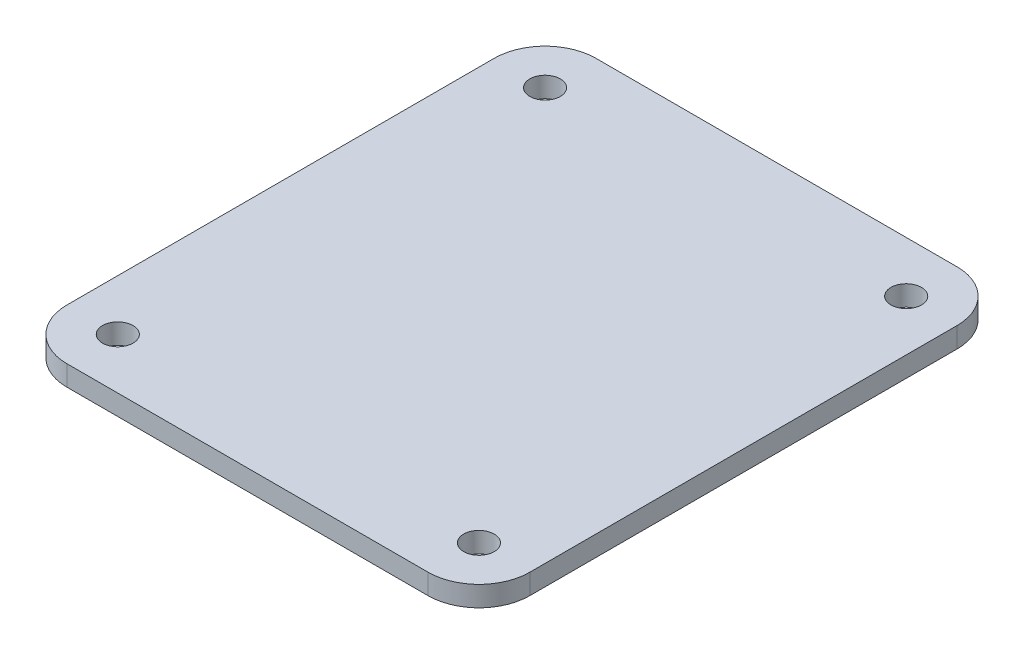
ISO-10303-21;
HEADER;
FILE_DESCRIPTION(('STEP AP214'),'2;1');
FILE_NAME('part.step','',(''),(''),'','','');
FILE_SCHEMA(('AUTOMOTIVE_DESIGN { 1 0 10303 214 1 1 1 1 }'));
ENDSEC;
DATA;
#1=APPLICATION_CONTEXT('core data for automotive mechanical design processes');
#2=APPLICATION_PROTOCOL_DEFINITION('international standard','automotive_design',2000,#1);
#3=PRODUCT_CONTEXT('',#1,'mechanical');
#4=PRODUCT('Part','Part','',(#3));
#5=PRODUCT_RELATED_PRODUCT_CATEGORY('part','',(#4));
#6=PRODUCT_DEFINITION_FORMATION('','',#4);
#7=PRODUCT_DEFINITION_CONTEXT('part definition',#1,'design');
#8=PRODUCT_DEFINITION('design','',#6,#7);
#9=PRODUCT_DEFINITION_SHAPE('','',#8);
#10=(LENGTH_UNIT() NAMED_UNIT(*) SI_UNIT(.MILLI.,.METRE.));
#11=(NAMED_UNIT(*) PLANE_ANGLE_UNIT() SI_UNIT($,.RADIAN.));
#12=(NAMED_UNIT(*) SI_UNIT($,.STERADIAN.) SOLID_ANGLE_UNIT());
#13=UNCERTAINTY_MEASURE_WITH_UNIT(LENGTH_MEASURE(1.E-05),#10,'distance_accuracy_value','');
#14=(GEOMETRIC_REPRESENTATION_CONTEXT(3) GLOBAL_UNCERTAINTY_ASSIGNED_CONTEXT((#13)) GLOBAL_UNIT_ASSIGNED_CONTEXT((#10,
#11,#12)) REPRESENTATION_CONTEXT('',''));
#15=CARTESIAN_POINT('',(0.,0.,0.));
#16=DIRECTION('',(0.,0.,1.));
#17=DIRECTION('',(1.,0.,0.));
#18=AXIS2_PLACEMENT_3D('',#15,#16,#17);
#19=CARTESIAN_POINT('',(-17.75,2.,21.));
#20=DIRECTION('',(0.,-1.,0.));
#21=DIRECTION('',(0.,0.,-1.));
#22=AXIS2_PLACEMENT_3D('',#19,#20,#21);
#23=PLANE('',#22);
#24=CARTESIAN_POINT('',(-17.75,2.,21.));
#25=DIRECTION('',(0.,1.,0.));
#26=DIRECTION('',(0.,0.,1.));
#27=AXIS2_PLACEMENT_3D('',#24,#25,#26);
#28=CIRCLE('',#27,1.5);
#29=CARTESIAN_POINT('',(-17.75,2.,22.5));
#30=VERTEX_POINT('',#29);
#31=EDGE_CURVE('E188',#30,#30,#28,.T.);
#32=ORIENTED_EDGE('',*,*,#31,.F.);
#33=EDGE_LOOP('',(#32));
#34=FACE_BOUND('',#33,.T.);
#35=CARTESIAN_POINT('',(17.75,2.,-21.));
#36=DIRECTION('',(0.,1.,0.));
#37=DIRECTION('',(0.,0.,1.));
#38=AXIS2_PLACEMENT_3D('',#35,#36,#37);
#39=CIRCLE('',#38,1.5);
#40=CARTESIAN_POINT('',(17.75,2.,-19.5));
#41=VERTEX_POINT('',#40);
#42=EDGE_CURVE('E134',#41,#41,#39,.T.);
#43=ORIENTED_EDGE('',*,*,#42,.F.);
#44=EDGE_LOOP('',(#43));
#45=FACE_BOUND('',#44,.T.);
#46=CARTESIAN_POINT('',(-17.75,2.,21.));
#47=DIRECTION('',(0.,1.,0.));
#48=DIRECTION('',(0.,0.,-1.));
#49=AXIS2_PLACEMENT_3D('',#46,#47,#48);
#50=CIRCLE('',#49,5.);
#51=CARTESIAN_POINT('',(-22.75,2.,21.));
#52=VERTEX_POINT('',#51);
#53=CARTESIAN_POINT('',(-17.75,2.,26.));
#54=VERTEX_POINT('',#53);
#55=EDGE_CURVE('E145',#52,#54,#50,.T.);
#56=ORIENTED_EDGE('',*,*,#55,.T.);
#57=DIRECTION('',(1.,0.,0.));
#58=VECTOR('',#57,1.);
#59=CARTESIAN_POINT('',(-17.75,2.,26.));
#60=LINE('',#59,#58);
#61=CARTESIAN_POINT('',(17.75,2.,26.));
#62=VERTEX_POINT('',#61);
#63=EDGE_CURVE('E93',#54,#62,#60,.T.);
#64=ORIENTED_EDGE('',*,*,#63,.T.);
#65=CARTESIAN_POINT('',(17.75,2.,21.));
#66=DIRECTION('',(0.,1.,0.));
#67=DIRECTION('',(0.,0.,-1.));
#68=AXIS2_PLACEMENT_3D('',#65,#66,#67);
#69=CIRCLE('',#68,5.);
#70=CARTESIAN_POINT('',(22.75,2.,21.));
#71=VERTEX_POINT('',#70);
#72=EDGE_CURVE('E160',#62,#71,#69,.T.);
#73=ORIENTED_EDGE('',*,*,#72,.T.);
#74=DIRECTION('',(0.,0.,-1.));
#75=VECTOR('',#74,1.);
#76=CARTESIAN_POINT('',(22.75,2.,-21.));
#77=LINE('',#76,#75);
#78=CARTESIAN_POINT('',(22.75,2.,-21.));
#79=VERTEX_POINT('',#78);
#80=EDGE_CURVE('E173',#71,#79,#77,.T.);
#81=ORIENTED_EDGE('',*,*,#80,.T.);
#82=CARTESIAN_POINT('',(17.75,2.,-21.));
#83=DIRECTION('',(0.,1.,0.));
#84=DIRECTION('',(0.,0.,-1.));
#85=AXIS2_PLACEMENT_3D('',#82,#83,#84);
#86=CIRCLE('',#85,5.);
#87=CARTESIAN_POINT('',(17.75,2.,-26.));
#88=VERTEX_POINT('',#87);
#89=EDGE_CURVE('E112',#79,#88,#86,.T.);
#90=ORIENTED_EDGE('',*,*,#89,.T.);
#91=DIRECTION('',(-1.,0.,0.));
#92=VECTOR('',#91,1.);
#93=CARTESIAN_POINT('',(-17.75,2.,-26.));
#94=LINE('',#93,#92);
#95=CARTESIAN_POINT('',(-17.75,2.,-26.));
#96=VERTEX_POINT('',#95);
#97=EDGE_CURVE('E106',#88,#96,#94,.T.);
#98=ORIENTED_EDGE('',*,*,#97,.T.);
#99=CARTESIAN_POINT('',(-17.75,2.,-21.));
#100=DIRECTION('',(0.,1.,0.));
#101=DIRECTION('',(0.,0.,1.));
#102=AXIS2_PLACEMENT_3D('',#99,#100,#101);
#103=CIRCLE('',#102,5.);
#104=CARTESIAN_POINT('',(-22.75,2.,-21.));
#105=VERTEX_POINT('',#104);
#106=EDGE_CURVE('E110',#96,#105,#103,.T.);
#107=ORIENTED_EDGE('',*,*,#106,.T.);
#108=DIRECTION('',(0.,0.,1.));
#109=VECTOR('',#108,1.);
#110=CARTESIAN_POINT('',(-22.75,2.,-21.));
#111=LINE('',#110,#109);
#112=EDGE_CURVE('E50',#105,#52,#111,.T.);
#113=ORIENTED_EDGE('',*,*,#112,.T.);
#114=EDGE_LOOP('',(#56,#64,#73,#81,#90,#98,#107,#113));
#115=FACE_BOUND('',#114,.T.);
#116=CARTESIAN_POINT('',(-17.75,2.,-21.));
#117=DIRECTION('',(0.,1.,0.));
#118=DIRECTION('',(0.,0.,1.));
#119=AXIS2_PLACEMENT_3D('',#116,#117,#118);
#120=CIRCLE('',#119,1.5);
#121=CARTESIAN_POINT('',(-17.75,2.,-19.5));
#122=VERTEX_POINT('',#121);
#123=EDGE_CURVE('E182',#122,#122,#120,.T.);
#124=ORIENTED_EDGE('',*,*,#123,.F.);
#125=EDGE_LOOP('',(#124));
#126=FACE_BOUND('',#125,.T.);
#127=CARTESIAN_POINT('',(17.75,2.,21.));
#128=DIRECTION('',(0.,1.,0.));
#129=DIRECTION('',(0.,0.,1.));
#130=AXIS2_PLACEMENT_3D('',#127,#128,#129);
#131=CIRCLE('',#130,1.5);
#132=CARTESIAN_POINT('',(17.75,2.,22.5));
#133=VERTEX_POINT('',#132);
#134=EDGE_CURVE('E194',#133,#133,#131,.T.);
#135=ORIENTED_EDGE('',*,*,#134,.F.);
#136=EDGE_LOOP('',(#135));
#137=FACE_BOUND('',#136,.T.);
#138=ADVANCED_FACE('F33',(#34,#45,#115,#126,#137),#23,.F.);
#139=CARTESIAN_POINT('',(-17.75,0.,21.));
#140=DIRECTION('',(0.,-1.,0.));
#141=DIRECTION('',(0.,0.,-1.));
#142=AXIS2_PLACEMENT_3D('',#139,#140,#141);
#143=PLANE('',#142);
#144=CARTESIAN_POINT('',(-17.75,0.,21.));
#145=DIRECTION('',(0.,1.,0.));
#146=DIRECTION('',(0.,0.,1.));
#147=AXIS2_PLACEMENT_3D('',#144,#145,#146);
#148=CIRCLE('',#147,1.5);
#149=CARTESIAN_POINT('',(-17.75,0.,22.5));
#150=VERTEX_POINT('',#149);
#151=EDGE_CURVE('E191',#150,#150,#148,.T.);
#152=ORIENTED_EDGE('',*,*,#151,.T.);
#153=EDGE_LOOP('',(#152));
#154=FACE_BOUND('',#153,.T.);
#155=CARTESIAN_POINT('',(17.75,0.,-21.));
#156=DIRECTION('',(0.,1.,0.));
#157=DIRECTION('',(0.,0.,1.));
#158=AXIS2_PLACEMENT_3D('',#155,#156,#157);
#159=CIRCLE('',#158,1.5);
#160=CARTESIAN_POINT('',(17.75,0.,-19.5));
#161=VERTEX_POINT('',#160);
#162=EDGE_CURVE('E179',#161,#161,#159,.T.);
#163=ORIENTED_EDGE('',*,*,#162,.T.);
#164=EDGE_LOOP('',(#163));
#165=FACE_BOUND('',#164,.T.);
#166=CARTESIAN_POINT('',(-17.75,0.,21.));
#167=DIRECTION('',(0.,1.,0.));
#168=DIRECTION('',(0.,0.,-1.));
#169=AXIS2_PLACEMENT_3D('',#166,#167,#168);
#170=CIRCLE('',#169,5.);
#171=CARTESIAN_POINT('',(-22.75,0.,21.));
#172=VERTEX_POINT('',#171);
#173=CARTESIAN_POINT('',(-17.75,0.,26.));
#174=VERTEX_POINT('',#173);
#175=EDGE_CURVE('E130',#172,#174,#170,.T.);
#176=ORIENTED_EDGE('',*,*,#175,.F.);
#177=DIRECTION('',(0.,0.,1.));
#178=VECTOR('',#177,1.);
#179=CARTESIAN_POINT('',(-22.75,0.,-21.));
#180=LINE('',#179,#178);
#181=CARTESIAN_POINT('',(-22.75,0.,-21.));
#182=VERTEX_POINT('',#181);
#183=EDGE_CURVE('E85',#182,#172,#180,.T.);
#184=ORIENTED_EDGE('',*,*,#183,.F.);
#185=CARTESIAN_POINT('',(-17.75,0.,-21.));
#186=DIRECTION('',(0.,1.,0.));
#187=DIRECTION('',(0.,0.,1.));
#188=AXIS2_PLACEMENT_3D('',#185,#186,#187);
#189=CIRCLE('',#188,5.);
#190=CARTESIAN_POINT('',(-17.75,0.,-26.));
#191=VERTEX_POINT('',#190);
#192=EDGE_CURVE('E79',#191,#182,#189,.T.);
#193=ORIENTED_EDGE('',*,*,#192,.F.);
#194=DIRECTION('',(-1.,0.,0.));
#195=VECTOR('',#194,1.);
#196=CARTESIAN_POINT('',(-17.75,0.,-26.));
#197=LINE('',#196,#195);
#198=CARTESIAN_POINT('',(17.75,0.,-26.));
#199=VERTEX_POINT('',#198);
#200=EDGE_CURVE('E120',#199,#191,#197,.T.);
#201=ORIENTED_EDGE('',*,*,#200,.F.);
#202=CARTESIAN_POINT('',(17.75,0.,-21.));
#203=DIRECTION('',(0.,1.,0.));
#204=DIRECTION('',(0.,0.,-1.));
#205=AXIS2_PLACEMENT_3D('',#202,#203,#204);
#206=CIRCLE('',#205,5.);
#207=CARTESIAN_POINT('',(22.75,0.,-21.));
#208=VERTEX_POINT('',#207);
#209=EDGE_CURVE('E140',#208,#199,#206,.T.);
#210=ORIENTED_EDGE('',*,*,#209,.F.);
#211=DIRECTION('',(0.,0.,-1.));
#212=VECTOR('',#211,1.);
#213=CARTESIAN_POINT('',(22.75,0.,-21.));
#214=LINE('',#213,#212);
#215=CARTESIAN_POINT('',(22.75,0.,21.));
#216=VERTEX_POINT('',#215);
#217=EDGE_CURVE('E138',#216,#208,#214,.T.);
#218=ORIENTED_EDGE('',*,*,#217,.F.);
#219=CARTESIAN_POINT('',(17.75,0.,21.));
#220=DIRECTION('',(0.,1.,0.));
#221=DIRECTION('',(0.,0.,-1.));
#222=AXIS2_PLACEMENT_3D('',#219,#220,#221);
#223=CIRCLE('',#222,5.);
#224=CARTESIAN_POINT('',(17.75,0.,26.));
#225=VERTEX_POINT('',#224);
#226=EDGE_CURVE('E136',#225,#216,#223,.T.);
#227=ORIENTED_EDGE('',*,*,#226,.F.);
#228=DIRECTION('',(1.,0.,0.));
#229=VECTOR('',#228,1.);
#230=CARTESIAN_POINT('',(-17.75,0.,26.));
#231=LINE('',#230,#229);
#232=EDGE_CURVE('E133',#174,#225,#231,.T.);
#233=ORIENTED_EDGE('',*,*,#232,.F.);
#234=EDGE_LOOP('',(#176,#184,#193,#201,#210,#218,#227,#233));
#235=FACE_BOUND('',#234,.T.);
#236=CARTESIAN_POINT('',(-17.75,0.,-21.));
#237=DIRECTION('',(0.,1.,0.));
#238=DIRECTION('',(0.,0.,1.));
#239=AXIS2_PLACEMENT_3D('',#236,#237,#238);
#240=CIRCLE('',#239,1.5);
#241=CARTESIAN_POINT('',(-17.75,0.,-19.5));
#242=VERTEX_POINT('',#241);
#243=EDGE_CURVE('E185',#242,#242,#240,.T.);
#244=ORIENTED_EDGE('',*,*,#243,.T.);
#245=EDGE_LOOP('',(#244));
#246=FACE_BOUND('',#245,.T.);
#247=CARTESIAN_POINT('',(17.75,0.,21.));
#248=DIRECTION('',(0.,1.,0.));
#249=DIRECTION('',(0.,0.,1.));
#250=AXIS2_PLACEMENT_3D('',#247,#248,#249);
#251=CIRCLE('',#250,1.5);
#252=CARTESIAN_POINT('',(17.75,0.,22.5));
#253=VERTEX_POINT('',#252);
#254=EDGE_CURVE('E197',#253,#253,#251,.T.);
#255=ORIENTED_EDGE('',*,*,#254,.T.);
#256=EDGE_LOOP('',(#255));
#257=FACE_BOUND('',#256,.T.);
#258=ADVANCED_FACE('F164',(#154,#165,#235,#246,#257),#143,.T.);
#259=CARTESIAN_POINT('',(-17.75,2.,21.));
#260=DIRECTION('',(0.,-1.,0.));
#261=DIRECTION('',(0.,0.,-1.));
#262=AXIS2_PLACEMENT_3D('',#259,#260,#261);
#263=CYLINDRICAL_SURFACE('',#262,5.);
#264=ORIENTED_EDGE('',*,*,#175,.T.);
#265=DIRECTION('',(0.,-1.,0.));
#266=VECTOR('',#265,1.);
#267=CARTESIAN_POINT('',(-17.75,2.,26.));
#268=LINE('',#267,#266);
#269=EDGE_CURVE('E11',#54,#174,#268,.T.);
#270=ORIENTED_EDGE('',*,*,#269,.F.);
#271=ORIENTED_EDGE('',*,*,#55,.F.);
#272=DIRECTION('',(0.,-1.,0.));
#273=VECTOR('',#272,1.);
#274=CARTESIAN_POINT('',(-22.75,2.,21.));
#275=LINE('',#274,#273);
#276=EDGE_CURVE('E126',#52,#172,#275,.T.);
#277=ORIENTED_EDGE('',*,*,#276,.T.);
#278=EDGE_LOOP('',(#264,#270,#271,#277));
#279=FACE_BOUND('',#278,.T.);
#280=ADVANCED_FACE('F35',(#279),#263,.T.);
#281=CARTESIAN_POINT('',(-17.75,2.,26.));
#282=DIRECTION('',(0.,0.,-1.));
#283=DIRECTION('',(-1.,0.,0.));
#284=AXIS2_PLACEMENT_3D('',#281,#282,#283);
#285=PLANE('',#284);
#286=ORIENTED_EDGE('',*,*,#232,.T.);
#287=DIRECTION('',(0.,-1.,0.));
#288=VECTOR('',#287,1.);
#289=CARTESIAN_POINT('',(17.75,2.,26.));
#290=LINE('',#289,#288);
#291=EDGE_CURVE('E42',#62,#225,#290,.T.);
#292=ORIENTED_EDGE('',*,*,#291,.F.);
#293=ORIENTED_EDGE('',*,*,#63,.F.);
#294=ORIENTED_EDGE('',*,*,#269,.T.);
#295=EDGE_LOOP('',(#286,#292,#293,#294));
#296=FACE_BOUND('',#295,.T.);
#297=ADVANCED_FACE('F232',(#296),#285,.F.);
#298=CARTESIAN_POINT('',(17.75,2.,21.));
#299=DIRECTION('',(0.,-1.,0.));
#300=DIRECTION('',(0.,0.,-1.));
#301=AXIS2_PLACEMENT_3D('',#298,#299,#300);
#302=CYLINDRICAL_SURFACE('',#301,5.);
#303=ORIENTED_EDGE('',*,*,#226,.T.);
#304=DIRECTION('',(0.,-1.,0.));
#305=VECTOR('',#304,1.);
#306=CARTESIAN_POINT('',(22.75,2.,21.));
#307=LINE('',#306,#305);
#308=EDGE_CURVE('E152',#71,#216,#307,.T.);
#309=ORIENTED_EDGE('',*,*,#308,.F.);
#310=ORIENTED_EDGE('',*,*,#72,.F.);
#311=ORIENTED_EDGE('',*,*,#291,.T.);
#312=EDGE_LOOP('',(#303,#309,#310,#311));
#313=FACE_BOUND('',#312,.T.);
#314=ADVANCED_FACE('F158',(#313),#302,.T.);
#315=CARTESIAN_POINT('',(22.75,2.,-21.));
#316=DIRECTION('',(-1.,0.,0.));
#317=DIRECTION('',(0.,0.,1.));
#318=AXIS2_PLACEMENT_3D('',#315,#316,#317);
#319=PLANE('',#318);
#320=ORIENTED_EDGE('',*,*,#217,.T.);
#321=DIRECTION('',(0.,-1.,0.));
#322=VECTOR('',#321,1.);
#323=CARTESIAN_POINT('',(22.75,2.,-21.));
#324=LINE('',#323,#322);
#325=EDGE_CURVE('E149',#79,#208,#324,.T.);
#326=ORIENTED_EDGE('',*,*,#325,.F.);
#327=ORIENTED_EDGE('',*,*,#80,.F.);
#328=ORIENTED_EDGE('',*,*,#308,.T.);
#329=EDGE_LOOP('',(#320,#326,#327,#328));
#330=FACE_BOUND('',#329,.T.);
#331=ADVANCED_FACE('F169',(#330),#319,.F.);
#332=CARTESIAN_POINT('',(17.75,2.,-21.));
#333=DIRECTION('',(0.,-1.,0.));
#334=DIRECTION('',(0.,0.,-1.));
#335=AXIS2_PLACEMENT_3D('',#332,#333,#334);
#336=CYLINDRICAL_SURFACE('',#335,5.);
#337=ORIENTED_EDGE('',*,*,#209,.T.);
#338=DIRECTION('',(0.,-1.,0.));
#339=VECTOR('',#338,1.);
#340=CARTESIAN_POINT('',(17.75,2.,-26.));
#341=LINE('',#340,#339);
#342=EDGE_CURVE('E121',#88,#199,#341,.T.);
#343=ORIENTED_EDGE('',*,*,#342,.F.);
#344=ORIENTED_EDGE('',*,*,#89,.F.);
#345=ORIENTED_EDGE('',*,*,#325,.T.);
#346=EDGE_LOOP('',(#337,#343,#344,#345));
#347=FACE_BOUND('',#346,.T.);
#348=ADVANCED_FACE('F172',(#347),#336,.T.);
#349=CARTESIAN_POINT('',(-17.75,2.,-26.));
#350=DIRECTION('',(0.,0.,1.));
#351=DIRECTION('',(1.,0.,0.));
#352=AXIS2_PLACEMENT_3D('',#349,#350,#351);
#353=PLANE('',#352);
#354=ORIENTED_EDGE('',*,*,#200,.T.);
#355=DIRECTION('',(0.,-1.,0.));
#356=VECTOR('',#355,1.);
#357=CARTESIAN_POINT('',(-17.75,2.,-26.));
#358=LINE('',#357,#356);
#359=EDGE_CURVE('E117',#96,#191,#358,.T.);
#360=ORIENTED_EDGE('',*,*,#359,.F.);
#361=ORIENTED_EDGE('',*,*,#97,.F.);
#362=ORIENTED_EDGE('',*,*,#342,.T.);
#363=EDGE_LOOP('',(#354,#360,#361,#362));
#364=FACE_BOUND('',#363,.T.);
#365=ADVANCED_FACE('F118',(#364),#353,.F.);
#366=CARTESIAN_POINT('',(-17.75,2.,-21.));
#367=DIRECTION('',(0.,-1.,0.));
#368=DIRECTION('',(0.,0.,-1.));
#369=AXIS2_PLACEMENT_3D('',#366,#367,#368);
#370=CYLINDRICAL_SURFACE('',#369,5.);
#371=ORIENTED_EDGE('',*,*,#192,.T.);
#372=DIRECTION('',(0.,-1.,0.));
#373=VECTOR('',#372,1.);
#374=CARTESIAN_POINT('',(-22.75,2.,-21.));
#375=LINE('',#374,#373);
#376=EDGE_CURVE('E122',#105,#182,#375,.T.);
#377=ORIENTED_EDGE('',*,*,#376,.F.);
#378=ORIENTED_EDGE('',*,*,#106,.F.);
#379=ORIENTED_EDGE('',*,*,#359,.T.);
#380=EDGE_LOOP('',(#371,#377,#378,#379));
#381=FACE_BOUND('',#380,.T.);
#382=ADVANCED_FACE('F124',(#381),#370,.T.);
#383=CARTESIAN_POINT('',(-22.75,2.,-21.));
#384=DIRECTION('',(1.,0.,0.));
#385=DIRECTION('',(0.,0.,-1.));
#386=AXIS2_PLACEMENT_3D('',#383,#384,#385);
#387=PLANE('',#386);
#388=ORIENTED_EDGE('',*,*,#183,.T.);
#389=ORIENTED_EDGE('',*,*,#276,.F.);
#390=ORIENTED_EDGE('',*,*,#112,.F.);
#391=ORIENTED_EDGE('',*,*,#376,.T.);
#392=EDGE_LOOP('',(#388,#389,#390,#391));
#393=FACE_BOUND('',#392,.T.);
#394=ADVANCED_FACE('F220',(#393),#387,.F.);
#395=CARTESIAN_POINT('',(17.75,2.,-21.));
#396=DIRECTION('',(0.,-1.,0.));
#397=DIRECTION('',(0.,0.,-1.));
#398=AXIS2_PLACEMENT_3D('',#395,#396,#397);
#399=CYLINDRICAL_SURFACE('',#398,1.5);
#400=ORIENTED_EDGE('',*,*,#42,.T.);
#401=EDGE_LOOP('',(#400));
#402=FACE_BOUND('',#401,.T.);
#403=ORIENTED_EDGE('',*,*,#162,.F.);
#404=EDGE_LOOP('',(#403));
#405=FACE_BOUND('',#404,.T.);
#406=ADVANCED_FACE('F217',(#402,#405),#399,.F.);
#407=CARTESIAN_POINT('',(-17.75,2.,-21.));
#408=DIRECTION('',(0.,-1.,0.));
#409=DIRECTION('',(0.,0.,-1.));
#410=AXIS2_PLACEMENT_3D('',#407,#408,#409);
#411=CYLINDRICAL_SURFACE('',#410,1.5);
#412=ORIENTED_EDGE('',*,*,#123,.T.);
#413=EDGE_LOOP('',(#412));
#414=FACE_BOUND('',#413,.T.);
#415=ORIENTED_EDGE('',*,*,#243,.F.);
#416=EDGE_LOOP('',(#415));
#417=FACE_BOUND('',#416,.T.);
#418=ADVANCED_FACE('F296',(#414,#417),#411,.F.);
#419=CARTESIAN_POINT('',(-17.75,2.,21.));
#420=DIRECTION('',(0.,-1.,0.));
#421=DIRECTION('',(0.,0.,-1.));
#422=AXIS2_PLACEMENT_3D('',#419,#420,#421);
#423=CYLINDRICAL_SURFACE('',#422,1.5);
#424=ORIENTED_EDGE('',*,*,#31,.T.);
#425=EDGE_LOOP('',(#424));
#426=FACE_BOUND('',#425,.T.);
#427=ORIENTED_EDGE('',*,*,#151,.F.);
#428=EDGE_LOOP('',(#427));
#429=FACE_BOUND('',#428,.T.);
#430=ADVANCED_FACE('F304',(#426,#429),#423,.F.);
#431=CARTESIAN_POINT('',(17.75,2.,21.));
#432=DIRECTION('',(0.,-1.,0.));
#433=DIRECTION('',(0.,0.,-1.));
#434=AXIS2_PLACEMENT_3D('',#431,#432,#433);
#435=CYLINDRICAL_SURFACE('',#434,1.5);
#436=ORIENTED_EDGE('',*,*,#134,.T.);
#437=EDGE_LOOP('',(#436));
#438=FACE_BOUND('',#437,.T.);
#439=ORIENTED_EDGE('',*,*,#254,.F.);
#440=EDGE_LOOP('',(#439));
#441=FACE_BOUND('',#440,.T.);
#442=ADVANCED_FACE('F203',(#438,#441),#435,.F.);
#443=CLOSED_SHELL('',(#138,#258,#280,#297,#314,#331,#348,#365,#382,#394,#406,#418,#430,#442));
#444=MANIFOLD_SOLID_BREP('B2',#443);
#445=ADVANCED_BREP_SHAPE_REPRESENTATION('',(#18,#444),#14);
#446=SHAPE_DEFINITION_REPRESENTATION(#9,#445);
ENDSEC;
END-ISO-10303-21;
